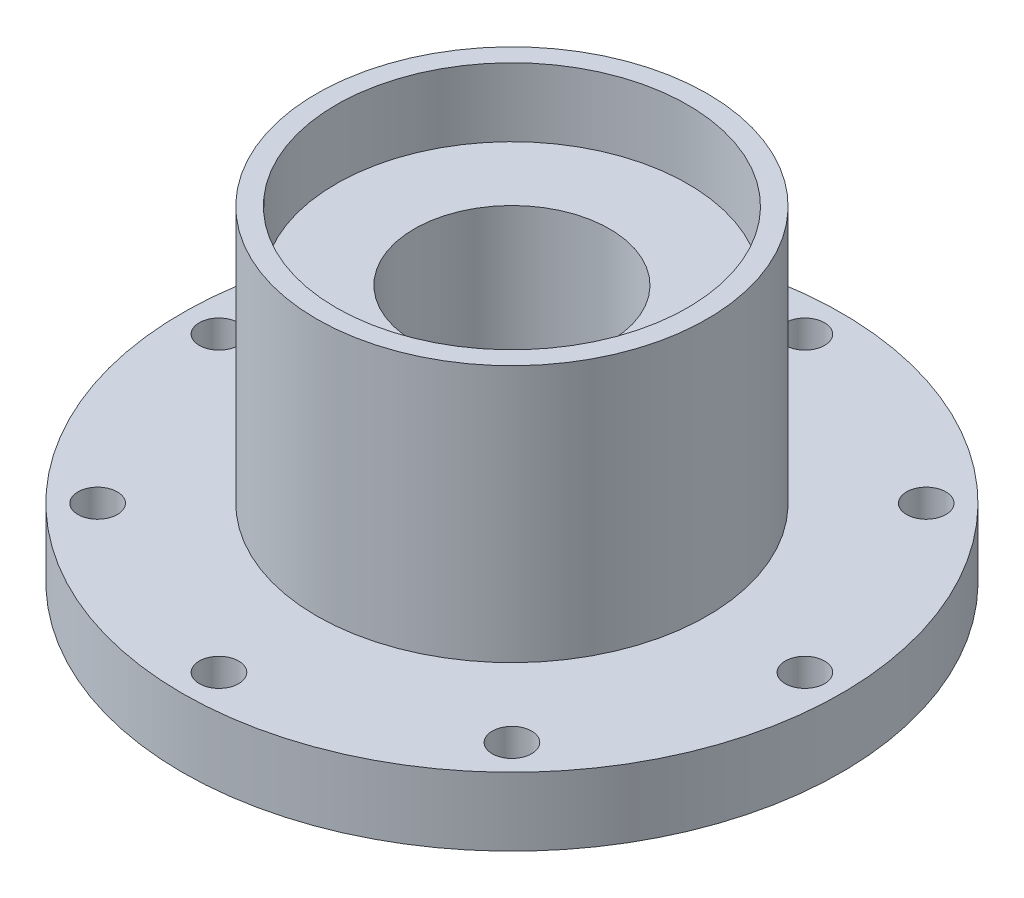
ISO-10303-21;
HEADER;
FILE_DESCRIPTION(('STEP AP214'),'2;1');
FILE_NAME('part.step','',(''),(''),'','','');
FILE_SCHEMA(('AUTOMOTIVE_DESIGN { 1 0 10303 214 1 1 1 1 }'));
ENDSEC;
DATA;
#1=APPLICATION_CONTEXT('core data for automotive mechanical design processes');
#2=APPLICATION_PROTOCOL_DEFINITION('international standard','automotive_design',2000,#1);
#3=PRODUCT_CONTEXT('',#1,'mechanical');
#4=PRODUCT('Part','Part','',(#3));
#5=PRODUCT_RELATED_PRODUCT_CATEGORY('part','',(#4));
#6=PRODUCT_DEFINITION_FORMATION('','',#4);
#7=PRODUCT_DEFINITION_CONTEXT('part definition',#1,'design');
#8=PRODUCT_DEFINITION('design','',#6,#7);
#9=PRODUCT_DEFINITION_SHAPE('','',#8);
#10=(LENGTH_UNIT() NAMED_UNIT(*) SI_UNIT(.MILLI.,.METRE.));
#11=(NAMED_UNIT(*) PLANE_ANGLE_UNIT() SI_UNIT($,.RADIAN.));
#12=(NAMED_UNIT(*) SI_UNIT($,.STERADIAN.) SOLID_ANGLE_UNIT());
#13=UNCERTAINTY_MEASURE_WITH_UNIT(LENGTH_MEASURE(1.E-05),#10,'distance_accuracy_value','');
#14=(GEOMETRIC_REPRESENTATION_CONTEXT(3) GLOBAL_UNCERTAINTY_ASSIGNED_CONTEXT((#13)) GLOBAL_UNIT_ASSIGNED_CONTEXT((#10,
#11,#12)) REPRESENTATION_CONTEXT('',''));
#15=CARTESIAN_POINT('',(0.,0.,0.));
#16=DIRECTION('',(0.,0.,1.));
#17=DIRECTION('',(1.,0.,0.));
#18=AXIS2_PLACEMENT_3D('',#15,#16,#17);
#19=CARTESIAN_POINT('',(-1.1063836601785E-13,-65.1669439643822,13.5));
#20=DIRECTION('',(0.,1.,0.));
#21=DIRECTION('',(0.,0.,1.));
#22=AXIS2_PLACEMENT_3D('',#19,#20,#21);
#23=PLANE('',#22);
#24=CARTESIAN_POINT('',(-1.1063836601785E-13,-65.1669439643822,0.));
#25=DIRECTION('',(0.,1.,0.));
#26=DIRECTION('',(0.,0.,1.));
#27=AXIS2_PLACEMENT_3D('',#24,#25,#26);
#28=CIRCLE('',#27,15.);
#29=CARTESIAN_POINT('',(-1.1063836601785E-13,-65.1669439643822,15.));
#30=VERTEX_POINT('',#29);
#31=EDGE_CURVE('E10',#30,#30,#28,.T.);
#32=ORIENTED_EDGE('',*,*,#31,.T.);
#33=EDGE_LOOP('',(#32));
#34=FACE_BOUND('',#33,.T.);
#35=CARTESIAN_POINT('',(-1.1063836601785E-13,-65.1669439643822,0.));
#36=DIRECTION('',(0.,1.,0.));
#37=DIRECTION('',(0.,0.,1.));
#38=AXIS2_PLACEMENT_3D('',#35,#36,#37);
#39=CIRCLE('',#38,13.5);
#40=CARTESIAN_POINT('',(-1.1063836601785E-13,-65.1669439643822,13.5));
#41=VERTEX_POINT('',#40);
#42=EDGE_CURVE('E70',#41,#41,#39,.T.);
#43=ORIENTED_EDGE('',*,*,#42,.F.);
#44=EDGE_LOOP('',(#43));
#45=FACE_BOUND('',#44,.T.);
#46=ADVANCED_FACE('F33',(#34,#45),#23,.T.);
#47=CARTESIAN_POINT('',(-1.1063836601785E-13,-23.8517204496646,0.));
#48=DIRECTION('',(0.,1.,0.));
#49=DIRECTION('',(0.,0.,1.));
#50=AXIS2_PLACEMENT_3D('',#47,#48,#49);
#51=CYLINDRICAL_SURFACE('',#50,15.);
#52=CARTESIAN_POINT('',(-1.1063836601785E-13,-84.9169439643823,0.));
#53=DIRECTION('',(0.,1.,0.));
#54=DIRECTION('',(0.,0.,1.));
#55=AXIS2_PLACEMENT_3D('',#52,#53,#54);
#56=CIRCLE('',#55,15.);
#57=CARTESIAN_POINT('',(-1.1063836601785E-13,-84.9169439643823,15.));
#58=VERTEX_POINT('',#57);
#59=EDGE_CURVE('E39',#58,#58,#56,.T.);
#60=ORIENTED_EDGE('',*,*,#59,.T.);
#61=EDGE_LOOP('',(#60));
#62=FACE_BOUND('',#61,.T.);
#63=ORIENTED_EDGE('',*,*,#31,.F.);
#64=EDGE_LOOP('',(#63));
#65=FACE_BOUND('',#64,.T.);
#66=ADVANCED_FACE('F138',(#62,#65),#51,.T.);
#67=CARTESIAN_POINT('',(-1.1063836601785E-13,-84.9169439643823,15.));
#68=DIRECTION('',(0.,1.,0.));
#69=DIRECTION('',(0.,0.,1.));
#70=AXIS2_PLACEMENT_3D('',#67,#68,#69);
#71=PLANE('',#70);
#72=CARTESIAN_POINT('',(-1.1063836601785E-13,-84.9169439643823,-22.5));
#73=DIRECTION('',(0.,1.,0.));
#74=DIRECTION('',(0.,0.,1.));
#75=AXIS2_PLACEMENT_3D('',#72,#73,#74);
#76=CIRCLE('',#75,1.5125);
#77=CARTESIAN_POINT('',(-1.1063836601785E-13,-84.9169439643823,-20.9875));
#78=VERTEX_POINT('',#77);
#79=EDGE_CURVE('E73',#78,#78,#76,.F.);
#80=ORIENTED_EDGE('',*,*,#79,.T.);
#81=EDGE_LOOP('',(#80));
#82=FACE_BOUND('',#81,.T.);
#83=CARTESIAN_POINT('',(15.9099025766978,-84.9169439643823,-15.9099025766987));
#84=DIRECTION('',(0.,1.,0.));
#85=DIRECTION('',(0.,0.,1.));
#86=AXIS2_PLACEMENT_3D('',#83,#84,#85);
#87=CIRCLE('',#86,1.5125);
#88=CARTESIAN_POINT('',(15.9099025766978,-84.9169439643823,-14.3974025766987));
#89=VERTEX_POINT('',#88);
#90=EDGE_CURVE('E76',#89,#89,#87,.F.);
#91=ORIENTED_EDGE('',*,*,#90,.T.);
#92=EDGE_LOOP('',(#91));
#93=FACE_BOUND('',#92,.T.);
#94=CARTESIAN_POINT('',(22.5000000000018,-84.9169439643823,-1.92743242034277E-12));
#95=DIRECTION('',(0.,1.,0.));
#96=DIRECTION('',(0.,0.,1.));
#97=AXIS2_PLACEMENT_3D('',#94,#95,#96);
#98=CIRCLE('',#97,1.5125);
#99=CARTESIAN_POINT('',(22.5000000000018,-84.9169439643823,1.51249999999807));
#100=VERTEX_POINT('',#99);
#101=EDGE_CURVE('E79',#100,#100,#98,.F.);
#102=ORIENTED_EDGE('',*,*,#101,.T.);
#103=EDGE_LOOP('',(#102));
#104=FACE_BOUND('',#103,.T.);
#105=CARTESIAN_POINT('',(15.9099025767005,-84.9169439643823,15.909902576696));
#106=DIRECTION('',(0.,1.,0.));
#107=DIRECTION('',(0.,0.,1.));
#108=AXIS2_PLACEMENT_3D('',#105,#106,#107);
#109=CIRCLE('',#108,1.5125);
#110=CARTESIAN_POINT('',(15.9099025767005,-84.9169439643823,17.422402576696));
#111=VERTEX_POINT('',#110);
#112=EDGE_CURVE('E82',#111,#111,#109,.F.);
#113=ORIENTED_EDGE('',*,*,#112,.T.);
#114=EDGE_LOOP('',(#113));
#115=FACE_BOUND('',#114,.T.);
#116=CARTESIAN_POINT('',(3.71802604119245E-12,-84.9169439643823,22.5));
#117=DIRECTION('',(0.,1.,0.));
#118=DIRECTION('',(0.,0.,1.));
#119=AXIS2_PLACEMENT_3D('',#116,#117,#118);
#120=CIRCLE('',#119,1.5125);
#121=CARTESIAN_POINT('',(3.71802604119245E-12,-84.9169439643823,24.0125));
#122=VERTEX_POINT('',#121);
#123=EDGE_CURVE('E85',#122,#122,#120,.F.);
#124=ORIENTED_EDGE('',*,*,#123,.T.);
#125=EDGE_LOOP('',(#124));
#126=FACE_BOUND('',#125,.T.);
#127=CARTESIAN_POINT('',(-15.9099025766942,-84.9169439643823,15.9099025766987));
#128=DIRECTION('',(0.,1.,0.));
#129=DIRECTION('',(0.,0.,1.));
#130=AXIS2_PLACEMENT_3D('',#127,#128,#129);
#131=CIRCLE('',#130,1.5125);
#132=CARTESIAN_POINT('',(-15.9099025766942,-84.9169439643823,17.4224025766987));
#133=VERTEX_POINT('',#132);
#134=EDGE_CURVE('E88',#133,#133,#131,.F.);
#135=ORIENTED_EDGE('',*,*,#134,.T.);
#136=EDGE_LOOP('',(#135));
#137=FACE_BOUND('',#136,.T.);
#138=CARTESIAN_POINT('',(-22.4999999999982,-84.9169439643823,1.9039874421656E-12));
#139=DIRECTION('',(0.,1.,0.));
#140=DIRECTION('',(0.,0.,1.));
#141=AXIS2_PLACEMENT_3D('',#138,#139,#140);
#142=CIRCLE('',#141,1.5125);
#143=CARTESIAN_POINT('',(-22.4999999999982,-84.9169439643823,1.5125000000019));
#144=VERTEX_POINT('',#143);
#145=EDGE_CURVE('E91',#144,#144,#142,.F.);
#146=ORIENTED_EDGE('',*,*,#145,.T.);
#147=EDGE_LOOP('',(#146));
#148=FACE_BOUND('',#147,.T.);
#149=CARTESIAN_POINT('',(-15.9099025766969,-84.9169439643823,-15.909902576696));
#150=DIRECTION('',(0.,1.,0.));
#151=DIRECTION('',(0.,0.,1.));
#152=AXIS2_PLACEMENT_3D('',#149,#150,#151);
#153=CIRCLE('',#152,1.5125);
#154=CARTESIAN_POINT('',(-15.9099025766969,-84.9169439643823,-14.397402576696));
#155=VERTEX_POINT('',#154);
#156=EDGE_CURVE('E94',#155,#155,#153,.F.);
#157=ORIENTED_EDGE('',*,*,#156,.T.);
#158=EDGE_LOOP('',(#157));
#159=FACE_BOUND('',#158,.T.);
#160=CARTESIAN_POINT('',(-1.1063836601785E-13,-84.9169439643823,0.));
#161=DIRECTION('',(0.,1.,0.));
#162=DIRECTION('',(0.,0.,1.));
#163=AXIS2_PLACEMENT_3D('',#160,#161,#162);
#164=CIRCLE('',#163,25.3125);
#165=CARTESIAN_POINT('',(-1.1063836601785E-13,-84.9169439643823,25.3125));
#166=VERTEX_POINT('',#165);
#167=EDGE_CURVE('E43',#166,#166,#164,.T.);
#168=ORIENTED_EDGE('',*,*,#167,.T.);
#169=EDGE_LOOP('',(#168));
#170=FACE_BOUND('',#169,.T.);
#171=ORIENTED_EDGE('',*,*,#59,.F.);
#172=EDGE_LOOP('',(#171));
#173=FACE_BOUND('',#172,.T.);
#174=ADVANCED_FACE('F142',(#82,#93,#104,#115,#126,#137,#148,#159,#170,#173),#71,.T.);
#175=CARTESIAN_POINT('',(-1.1063836601785E-13,-23.8517204496646,0.));
#176=DIRECTION('',(0.,1.,0.));
#177=DIRECTION('',(0.,0.,1.));
#178=AXIS2_PLACEMENT_3D('',#175,#176,#177);
#179=CYLINDRICAL_SURFACE('',#178,25.3125);
#180=CARTESIAN_POINT('',(-1.1063836601785E-13,-90.1669439643822,0.));
#181=DIRECTION('',(0.,1.,0.));
#182=DIRECTION('',(0.,0.,1.));
#183=AXIS2_PLACEMENT_3D('',#180,#181,#182);
#184=CIRCLE('',#183,25.3125);
#185=CARTESIAN_POINT('',(-1.1063836601785E-13,-90.1669439643822,25.3125));
#186=VERTEX_POINT('',#185);
#187=EDGE_CURVE('E47',#186,#186,#184,.T.);
#188=ORIENTED_EDGE('',*,*,#187,.T.);
#189=EDGE_LOOP('',(#188));
#190=FACE_BOUND('',#189,.T.);
#191=ORIENTED_EDGE('',*,*,#167,.F.);
#192=EDGE_LOOP('',(#191));
#193=FACE_BOUND('',#192,.T.);
#194=ADVANCED_FACE('F185',(#190,#193),#179,.T.);
#195=CARTESIAN_POINT('',(-1.1063836601785E-13,-90.1669439643823,25.3125));
#196=DIRECTION('',(0.,-1.,0.));
#197=DIRECTION('',(0.,0.,-1.));
#198=AXIS2_PLACEMENT_3D('',#195,#196,#197);
#199=PLANE('',#198);
#200=CARTESIAN_POINT('',(-1.1063836601785E-13,-90.1669439643822,-22.5));
#201=DIRECTION('',(0.,1.,0.));
#202=DIRECTION('',(0.,0.,1.));
#203=AXIS2_PLACEMENT_3D('',#200,#201,#202);
#204=CIRCLE('',#203,1.5125);
#205=CARTESIAN_POINT('',(-1.1063836601785E-13,-90.1669439643822,-20.9875));
#206=VERTEX_POINT('',#205);
#207=EDGE_CURVE('E97',#206,#206,#204,.T.);
#208=ORIENTED_EDGE('',*,*,#207,.T.);
#209=EDGE_LOOP('',(#208));
#210=FACE_BOUND('',#209,.T.);
#211=CARTESIAN_POINT('',(15.9099025766978,-90.1669439643822,-15.9099025766987));
#212=DIRECTION('',(0.,1.,0.));
#213=DIRECTION('',(0.,0.,1.));
#214=AXIS2_PLACEMENT_3D('',#211,#212,#213);
#215=CIRCLE('',#214,1.5125);
#216=CARTESIAN_POINT('',(15.9099025766978,-90.1669439643822,-14.3974025766987));
#217=VERTEX_POINT('',#216);
#218=EDGE_CURVE('E116',#217,#217,#215,.T.);
#219=ORIENTED_EDGE('',*,*,#218,.T.);
#220=EDGE_LOOP('',(#219));
#221=FACE_BOUND('',#220,.T.);
#222=CARTESIAN_POINT('',(22.5000000000018,-90.1669439643822,-1.92743242034277E-12));
#223=DIRECTION('',(0.,1.,0.));
#224=DIRECTION('',(0.,0.,1.));
#225=AXIS2_PLACEMENT_3D('',#222,#223,#224);
#226=CIRCLE('',#225,1.5125);
#227=CARTESIAN_POINT('',(22.5000000000018,-90.1669439643822,1.51249999999807));
#228=VERTEX_POINT('',#227);
#229=EDGE_CURVE('E113',#228,#228,#226,.T.);
#230=ORIENTED_EDGE('',*,*,#229,.T.);
#231=EDGE_LOOP('',(#230));
#232=FACE_BOUND('',#231,.T.);
#233=CARTESIAN_POINT('',(15.9099025767005,-90.1669439643822,15.909902576696));
#234=DIRECTION('',(0.,1.,0.));
#235=DIRECTION('',(0.,0.,1.));
#236=AXIS2_PLACEMENT_3D('',#233,#234,#235);
#237=CIRCLE('',#236,1.5125);
#238=CARTESIAN_POINT('',(15.9099025767005,-90.1669439643822,17.422402576696));
#239=VERTEX_POINT('',#238);
#240=EDGE_CURVE('E110',#239,#239,#237,.T.);
#241=ORIENTED_EDGE('',*,*,#240,.T.);
#242=EDGE_LOOP('',(#241));
#243=FACE_BOUND('',#242,.T.);
#244=CARTESIAN_POINT('',(3.71802604119245E-12,-90.1669439643822,22.5));
#245=DIRECTION('',(0.,1.,0.));
#246=DIRECTION('',(0.,0.,1.));
#247=AXIS2_PLACEMENT_3D('',#244,#245,#246);
#248=CIRCLE('',#247,1.5125);
#249=CARTESIAN_POINT('',(3.71802604119245E-12,-90.1669439643822,24.0125));
#250=VERTEX_POINT('',#249);
#251=EDGE_CURVE('E107',#250,#250,#248,.T.);
#252=ORIENTED_EDGE('',*,*,#251,.T.);
#253=EDGE_LOOP('',(#252));
#254=FACE_BOUND('',#253,.T.);
#255=CARTESIAN_POINT('',(-15.9099025766942,-90.1669439643822,15.9099025766987));
#256=DIRECTION('',(0.,1.,0.));
#257=DIRECTION('',(0.,0.,1.));
#258=AXIS2_PLACEMENT_3D('',#255,#256,#257);
#259=CIRCLE('',#258,1.5125);
#260=CARTESIAN_POINT('',(-15.9099025766942,-90.1669439643822,17.4224025766987));
#261=VERTEX_POINT('',#260);
#262=EDGE_CURVE('E104',#261,#261,#259,.T.);
#263=ORIENTED_EDGE('',*,*,#262,.T.);
#264=EDGE_LOOP('',(#263));
#265=FACE_BOUND('',#264,.T.);
#266=CARTESIAN_POINT('',(-22.4999999999982,-90.1669439643822,1.9039874421656E-12));
#267=DIRECTION('',(0.,1.,0.));
#268=DIRECTION('',(0.,0.,1.));
#269=AXIS2_PLACEMENT_3D('',#266,#267,#268);
#270=CIRCLE('',#269,1.5125);
#271=CARTESIAN_POINT('',(-22.4999999999982,-90.1669439643822,1.5125000000019));
#272=VERTEX_POINT('',#271);
#273=EDGE_CURVE('E101',#272,#272,#270,.T.);
#274=ORIENTED_EDGE('',*,*,#273,.T.);
#275=EDGE_LOOP('',(#274));
#276=FACE_BOUND('',#275,.T.);
#277=CARTESIAN_POINT('',(-15.9099025766969,-90.1669439643822,-15.909902576696));
#278=DIRECTION('',(0.,1.,0.));
#279=DIRECTION('',(0.,0.,1.));
#280=AXIS2_PLACEMENT_3D('',#277,#278,#279);
#281=CIRCLE('',#280,1.5125);
#282=CARTESIAN_POINT('',(-15.9099025766969,-90.1669439643822,-14.397402576696));
#283=VERTEX_POINT('',#282);
#284=EDGE_CURVE('E98',#283,#283,#281,.T.);
#285=ORIENTED_EDGE('',*,*,#284,.T.);
#286=EDGE_LOOP('',(#285));
#287=FACE_BOUND('',#286,.T.);
#288=CARTESIAN_POINT('',(-1.1063836601785E-13,-90.1669439643822,0.));
#289=DIRECTION('',(0.,1.,0.));
#290=DIRECTION('',(0.,0.,1.));
#291=AXIS2_PLACEMENT_3D('',#288,#289,#290);
#292=CIRCLE('',#291,13.5);
#293=CARTESIAN_POINT('',(-1.1063836601785E-13,-90.1669439643822,13.5));
#294=VERTEX_POINT('',#293);
#295=EDGE_CURVE('E52',#294,#294,#292,.T.);
#296=ORIENTED_EDGE('',*,*,#295,.T.);
#297=EDGE_LOOP('',(#296));
#298=FACE_BOUND('',#297,.T.);
#299=ORIENTED_EDGE('',*,*,#187,.F.);
#300=EDGE_LOOP('',(#299));
#301=FACE_BOUND('',#300,.T.);
#302=ADVANCED_FACE('F122',(#210,#221,#232,#243,#254,#265,#276,#287,#298,#301),#199,.T.);
#303=CARTESIAN_POINT('',(-1.1063836601785E-13,-23.8517204496646,0.));
#304=DIRECTION('',(0.,1.,0.));
#305=DIRECTION('',(0.,0.,1.));
#306=AXIS2_PLACEMENT_3D('',#303,#304,#305);
#307=CYLINDRICAL_SURFACE('',#306,13.5);
#308=CARTESIAN_POINT('',(-1.1063836601785E-13,-84.9169439643823,0.));
#309=DIRECTION('',(0.,1.,0.));
#310=DIRECTION('',(0.,0.,1.));
#311=AXIS2_PLACEMENT_3D('',#308,#309,#310);
#312=CIRCLE('',#311,13.5);
#313=CARTESIAN_POINT('',(-1.1063836601785E-13,-84.9169439643823,13.5));
#314=VERTEX_POINT('',#313);
#315=EDGE_CURVE('E55',#314,#314,#312,.T.);
#316=ORIENTED_EDGE('',*,*,#315,.T.);
#317=EDGE_LOOP('',(#316));
#318=FACE_BOUND('',#317,.T.);
#319=ORIENTED_EDGE('',*,*,#295,.F.);
#320=EDGE_LOOP('',(#319));
#321=FACE_BOUND('',#320,.T.);
#322=ADVANCED_FACE('F174',(#318,#321),#307,.F.);
#323=CARTESIAN_POINT('',(-1.1063836601785E-13,-84.9169439643823,13.5));
#324=DIRECTION('',(0.,-1.,0.));
#325=DIRECTION('',(0.,0.,-1.));
#326=AXIS2_PLACEMENT_3D('',#323,#324,#325);
#327=PLANE('',#326);
#328=CARTESIAN_POINT('',(-1.1063836601785E-13,-84.9169439643823,0.));
#329=DIRECTION('',(0.,1.,0.));
#330=DIRECTION('',(0.,0.,1.));
#331=AXIS2_PLACEMENT_3D('',#328,#329,#330);
#332=CIRCLE('',#331,8.52499999999999);
#333=CARTESIAN_POINT('',(-1.1063836601785E-13,-84.9169439643823,8.52499999999998));
#334=VERTEX_POINT('',#333);
#335=EDGE_CURVE('E58',#334,#334,#332,.T.);
#336=ORIENTED_EDGE('',*,*,#335,.T.);
#337=EDGE_LOOP('',(#336));
#338=FACE_BOUND('',#337,.T.);
#339=ORIENTED_EDGE('',*,*,#315,.F.);
#340=EDGE_LOOP('',(#339));
#341=FACE_BOUND('',#340,.T.);
#342=ADVANCED_FACE('F168',(#338,#341),#327,.T.);
#343=CARTESIAN_POINT('',(-1.1063836601785E-13,-84.9169439643823,0.));
#344=DIRECTION('',(0.,-1.,0.));
#345=DIRECTION('',(0.,0.,-1.));
#346=AXIS2_PLACEMENT_3D('',#343,#344,#345);
#347=CONICAL_SURFACE('',#346,8.52499999999999,1.54641091762217);
#348=CARTESIAN_POINT('',(-1.1063836601785E-13,-84.8919439643822,0.));
#349=DIRECTION('',(0.,1.,0.));
#350=DIRECTION('',(0.,0.,1.));
#351=AXIS2_PLACEMENT_3D('',#348,#349,#350);
#352=CIRCLE('',#351,7.49999999999999);
#353=CARTESIAN_POINT('',(-1.1063836601785E-13,-84.8919439643822,7.49999999999998));
#354=VERTEX_POINT('',#353);
#355=EDGE_CURVE('E61',#354,#354,#352,.T.);
#356=ORIENTED_EDGE('',*,*,#355,.T.);
#357=EDGE_LOOP('',(#356));
#358=FACE_BOUND('',#357,.T.);
#359=ORIENTED_EDGE('',*,*,#335,.F.);
#360=EDGE_LOOP('',(#359));
#361=FACE_BOUND('',#360,.T.);
#362=ADVANCED_FACE('F162',(#358,#361),#347,.F.);
#363=CARTESIAN_POINT('',(-1.1063836601785E-13,-23.8517204496646,0.));
#364=DIRECTION('',(0.,1.,0.));
#365=DIRECTION('',(0.,0.,1.));
#366=AXIS2_PLACEMENT_3D('',#363,#364,#365);
#367=CYLINDRICAL_SURFACE('',#366,7.49999999999999);
#368=CARTESIAN_POINT('',(-1.1063836601785E-13,-70.4169439643823,0.));
#369=DIRECTION('',(0.,1.,0.));
#370=DIRECTION('',(0.,0.,1.));
#371=AXIS2_PLACEMENT_3D('',#368,#369,#370);
#372=CIRCLE('',#371,7.49999999999999);
#373=CARTESIAN_POINT('',(-1.1063836601785E-13,-70.4169439643823,7.49999999999998));
#374=VERTEX_POINT('',#373);
#375=EDGE_CURVE('E64',#374,#374,#372,.T.);
#376=ORIENTED_EDGE('',*,*,#375,.T.);
#377=EDGE_LOOP('',(#376));
#378=FACE_BOUND('',#377,.T.);
#379=ORIENTED_EDGE('',*,*,#355,.F.);
#380=EDGE_LOOP('',(#379));
#381=FACE_BOUND('',#380,.T.);
#382=ADVANCED_FACE('F156',(#378,#381),#367,.F.);
#383=CARTESIAN_POINT('',(-1.1063836601785E-13,-70.4169439643823,13.5));
#384=DIRECTION('',(0.,1.,0.));
#385=DIRECTION('',(0.,0.,1.));
#386=AXIS2_PLACEMENT_3D('',#383,#384,#385);
#387=PLANE('',#386);
#388=CARTESIAN_POINT('',(-1.1063836601785E-13,-70.4169439643823,0.));
#389=DIRECTION('',(0.,1.,0.));
#390=DIRECTION('',(0.,0.,1.));
#391=AXIS2_PLACEMENT_3D('',#388,#389,#390);
#392=CIRCLE('',#391,13.5);
#393=CARTESIAN_POINT('',(-1.1063836601785E-13,-70.4169439643823,13.5));
#394=VERTEX_POINT('',#393);
#395=EDGE_CURVE('E67',#394,#394,#392,.T.);
#396=ORIENTED_EDGE('',*,*,#395,.T.);
#397=EDGE_LOOP('',(#396));
#398=FACE_BOUND('',#397,.T.);
#399=ORIENTED_EDGE('',*,*,#375,.F.);
#400=EDGE_LOOP('',(#399));
#401=FACE_BOUND('',#400,.T.);
#402=ADVANCED_FACE('F150',(#398,#401),#387,.T.);
#403=CARTESIAN_POINT('',(-1.1063836601785E-13,-23.8517204496646,0.));
#404=DIRECTION('',(0.,1.,0.));
#405=DIRECTION('',(0.,0.,1.));
#406=AXIS2_PLACEMENT_3D('',#403,#404,#405);
#407=CYLINDRICAL_SURFACE('',#406,13.5);
#408=ORIENTED_EDGE('',*,*,#42,.T.);
#409=EDGE_LOOP('',(#408));
#410=FACE_BOUND('',#409,.T.);
#411=ORIENTED_EDGE('',*,*,#395,.F.);
#412=EDGE_LOOP('',(#411));
#413=FACE_BOUND('',#412,.T.);
#414=ADVANCED_FACE('F146',(#410,#413),#407,.F.);
#415=CARTESIAN_POINT('',(-15.9099025766969,-65.1669439643822,-15.909902576696));
#416=DIRECTION('',(0.,-1.,0.));
#417=DIRECTION('',(0.,0.,-1.));
#418=AXIS2_PLACEMENT_3D('',#415,#416,#417);
#419=CYLINDRICAL_SURFACE('',#418,1.5125);
#420=ORIENTED_EDGE('',*,*,#156,.F.);
#421=EDGE_LOOP('',(#420));
#422=FACE_BOUND('',#421,.T.);
#423=ORIENTED_EDGE('',*,*,#284,.F.);
#424=EDGE_LOOP('',(#423));
#425=FACE_BOUND('',#424,.T.);
#426=ADVANCED_FACE('F149',(#422,#425),#419,.F.);
#427=CARTESIAN_POINT('',(-22.4999999999982,-65.1669439643822,1.9039874421656E-12));
#428=DIRECTION('',(0.,-1.,0.));
#429=DIRECTION('',(0.,0.,-1.));
#430=AXIS2_PLACEMENT_3D('',#427,#428,#429);
#431=CYLINDRICAL_SURFACE('',#430,1.5125);
#432=ORIENTED_EDGE('',*,*,#145,.F.);
#433=EDGE_LOOP('',(#432));
#434=FACE_BOUND('',#433,.T.);
#435=ORIENTED_EDGE('',*,*,#273,.F.);
#436=EDGE_LOOP('',(#435));
#437=FACE_BOUND('',#436,.T.);
#438=ADVANCED_FACE('F204',(#434,#437),#431,.F.);
#439=CARTESIAN_POINT('',(-15.9099025766942,-65.1669439643822,15.9099025766987));
#440=DIRECTION('',(0.,-1.,0.));
#441=DIRECTION('',(0.,0.,-1.));
#442=AXIS2_PLACEMENT_3D('',#439,#440,#441);
#443=CYLINDRICAL_SURFACE('',#442,1.5125);
#444=ORIENTED_EDGE('',*,*,#134,.F.);
#445=EDGE_LOOP('',(#444));
#446=FACE_BOUND('',#445,.T.);
#447=ORIENTED_EDGE('',*,*,#262,.F.);
#448=EDGE_LOOP('',(#447));
#449=FACE_BOUND('',#448,.T.);
#450=ADVANCED_FACE('F208',(#446,#449),#443,.F.);
#451=CARTESIAN_POINT('',(3.71802604119245E-12,-65.1669439643822,22.5));
#452=DIRECTION('',(0.,-1.,0.));
#453=DIRECTION('',(0.,0.,-1.));
#454=AXIS2_PLACEMENT_3D('',#451,#452,#453);
#455=CYLINDRICAL_SURFACE('',#454,1.5125);
#456=ORIENTED_EDGE('',*,*,#123,.F.);
#457=EDGE_LOOP('',(#456));
#458=FACE_BOUND('',#457,.T.);
#459=ORIENTED_EDGE('',*,*,#251,.F.);
#460=EDGE_LOOP('',(#459));
#461=FACE_BOUND('',#460,.T.);
#462=ADVANCED_FACE('F212',(#458,#461),#455,.F.);
#463=CARTESIAN_POINT('',(15.9099025767005,-65.1669439643822,15.909902576696));
#464=DIRECTION('',(0.,-1.,0.));
#465=DIRECTION('',(0.,0.,-1.));
#466=AXIS2_PLACEMENT_3D('',#463,#464,#465);
#467=CYLINDRICAL_SURFACE('',#466,1.5125);
#468=ORIENTED_EDGE('',*,*,#112,.F.);
#469=EDGE_LOOP('',(#468));
#470=FACE_BOUND('',#469,.T.);
#471=ORIENTED_EDGE('',*,*,#240,.F.);
#472=EDGE_LOOP('',(#471));
#473=FACE_BOUND('',#472,.T.);
#474=ADVANCED_FACE('F216',(#470,#473),#467,.F.);
#475=CARTESIAN_POINT('',(22.5000000000018,-65.1669439643822,-1.92743242034277E-12));
#476=DIRECTION('',(0.,-1.,0.));
#477=DIRECTION('',(0.,0.,-1.));
#478=AXIS2_PLACEMENT_3D('',#475,#476,#477);
#479=CYLINDRICAL_SURFACE('',#478,1.5125);
#480=ORIENTED_EDGE('',*,*,#101,.F.);
#481=EDGE_LOOP('',(#480));
#482=FACE_BOUND('',#481,.T.);
#483=ORIENTED_EDGE('',*,*,#229,.F.);
#484=EDGE_LOOP('',(#483));
#485=FACE_BOUND('',#484,.T.);
#486=ADVANCED_FACE('F133',(#482,#485),#479,.F.);
#487=CARTESIAN_POINT('',(15.9099025766978,-65.1669439643822,-15.9099025766987));
#488=DIRECTION('',(0.,-1.,0.));
#489=DIRECTION('',(0.,0.,-1.));
#490=AXIS2_PLACEMENT_3D('',#487,#488,#489);
#491=CYLINDRICAL_SURFACE('',#490,1.5125);
#492=ORIENTED_EDGE('',*,*,#90,.F.);
#493=EDGE_LOOP('',(#492));
#494=FACE_BOUND('',#493,.T.);
#495=ORIENTED_EDGE('',*,*,#218,.F.);
#496=EDGE_LOOP('',(#495));
#497=FACE_BOUND('',#496,.T.);
#498=ADVANCED_FACE('F127',(#494,#497),#491,.F.);
#499=CARTESIAN_POINT('',(-1.1063836601785E-13,-65.1669439643822,-22.5));
#500=DIRECTION('',(0.,-1.,0.));
#501=DIRECTION('',(0.,0.,-1.));
#502=AXIS2_PLACEMENT_3D('',#499,#500,#501);
#503=CYLINDRICAL_SURFACE('',#502,1.5125);
#504=ORIENTED_EDGE('',*,*,#79,.F.);
#505=EDGE_LOOP('',(#504));
#506=FACE_BOUND('',#505,.T.);
#507=ORIENTED_EDGE('',*,*,#207,.F.);
#508=EDGE_LOOP('',(#507));
#509=FACE_BOUND('',#508,.T.);
#510=ADVANCED_FACE('F125',(#506,#509),#503,.F.);
#511=CLOSED_SHELL('',(#46,#66,#174,#194,#302,#322,#342,#362,#382,#402,#414,#426,#438,#450,#462,
#474,#486,#498,#510));
#512=MANIFOLD_SOLID_BREP('B2',#511);
#513=ADVANCED_BREP_SHAPE_REPRESENTATION('',(#18,#512),#14);
#514=SHAPE_DEFINITION_REPRESENTATION(#9,#513);
ENDSEC;
END-ISO-10303-21;
